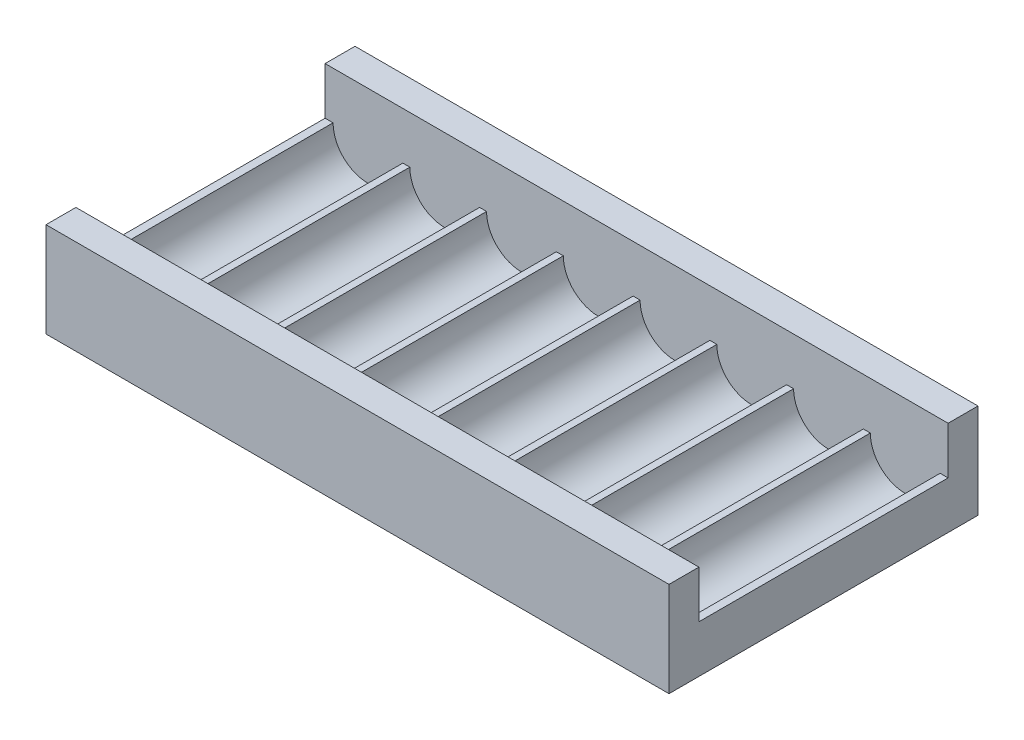
ISO-10303-21;
HEADER;
FILE_DESCRIPTION(('STEP AP214'),'2;1');
FILE_NAME('part.step','',(''),(''),'','','');
FILE_SCHEMA(('AUTOMOTIVE_DESIGN { 1 0 10303 214 1 1 1 1 }'));
ENDSEC;
DATA;
#1=APPLICATION_CONTEXT('core data for automotive mechanical design processes');
#2=APPLICATION_PROTOCOL_DEFINITION('international standard','automotive_design',2000,#1);
#3=PRODUCT_CONTEXT('',#1,'mechanical');
#4=PRODUCT('Part','Part','',(#3));
#5=PRODUCT_RELATED_PRODUCT_CATEGORY('part','',(#4));
#6=PRODUCT_DEFINITION_FORMATION('','',#4);
#7=PRODUCT_DEFINITION_CONTEXT('part definition',#1,'design');
#8=PRODUCT_DEFINITION('design','',#6,#7);
#9=PRODUCT_DEFINITION_SHAPE('','',#8);
#10=(LENGTH_UNIT() NAMED_UNIT(*) SI_UNIT(.MILLI.,.METRE.));
#11=(NAMED_UNIT(*) PLANE_ANGLE_UNIT() SI_UNIT($,.RADIAN.));
#12=(NAMED_UNIT(*) SI_UNIT($,.STERADIAN.) SOLID_ANGLE_UNIT());
#13=UNCERTAINTY_MEASURE_WITH_UNIT(LENGTH_MEASURE(1.E-05),#10,'distance_accuracy_value','');
#14=(GEOMETRIC_REPRESENTATION_CONTEXT(3) GLOBAL_UNCERTAINTY_ASSIGNED_CONTEXT((#13)) GLOBAL_UNIT_ASSIGNED_CONTEXT((#10,
#11,#12)) REPRESENTATION_CONTEXT('',''));
#15=CARTESIAN_POINT('',(0.,0.,0.));
#16=DIRECTION('',(0.,0.,1.));
#17=DIRECTION('',(1.,0.,0.));
#18=AXIS2_PLACEMENT_3D('',#15,#16,#17);
#19=CARTESIAN_POINT('',(0.,0.,6.));
#20=DIRECTION('',(0.,0.,-1.));
#21=DIRECTION('',(-1.,0.,0.));
#22=AXIS2_PLACEMENT_3D('',#19,#20,#21);
#23=PLANE('',#22);
#24=DIRECTION('',(-1.,0.,0.));
#25=VECTOR('',#24,1.);
#26=CARTESIAN_POINT('',(60.9,0.,6.));
#27=LINE('',#26,#25);
#28=CARTESIAN_POINT('',(62.5,0.,6.));
#29=VERTEX_POINT('',#28);
#30=CARTESIAN_POINT('',(60.9,0.,6.));
#31=VERTEX_POINT('',#30);
#32=EDGE_CURVE('E293',#29,#31,#27,.T.);
#33=ORIENTED_EDGE('',*,*,#32,.F.);
#34=DIRECTION('',(0.,1.,0.));
#35=VECTOR('',#34,1.);
#36=CARTESIAN_POINT('',(62.5,9.50000000000001,6.));
#37=LINE('',#36,#35);
#38=CARTESIAN_POINT('',(62.5,9.50000000000001,6.));
#39=VERTEX_POINT('',#38);
#40=EDGE_CURVE('E381',#29,#39,#37,.T.);
#41=ORIENTED_EDGE('',*,*,#40,.T.);
#42=DIRECTION('',(-1.,0.,0.));
#43=VECTOR('',#42,1.);
#44=CARTESIAN_POINT('',(62.5,9.50000000000001,6.));
#45=LINE('',#44,#43);
#46=CARTESIAN_POINT('',(-62.5,9.49999999999999,6.));
#47=VERTEX_POINT('',#46);
#48=EDGE_CURVE('E384',#39,#47,#45,.T.);
#49=ORIENTED_EDGE('',*,*,#48,.T.);
#50=DIRECTION('',(0.,-1.,0.));
#51=VECTOR('',#50,1.);
#52=CARTESIAN_POINT('',(-62.5,9.49999999999999,6.));
#53=LINE('',#52,#51);
#54=CARTESIAN_POINT('',(-62.5,0.,6.));
#55=VERTEX_POINT('',#54);
#56=EDGE_CURVE('E379',#47,#55,#53,.T.);
#57=ORIENTED_EDGE('',*,*,#56,.T.);
#58=DIRECTION('',(-1.,0.,0.));
#59=VECTOR('',#58,1.);
#60=CARTESIAN_POINT('',(-62.5,0.,6.));
#61=LINE('',#60,#59);
#62=CARTESIAN_POINT('',(-60.9,0.,6.));
#63=VERTEX_POINT('',#62);
#64=EDGE_CURVE('E290',#63,#55,#61,.T.);
#65=ORIENTED_EDGE('',*,*,#64,.F.);
#66=CARTESIAN_POINT('',(-53.9,0.,6.));
#67=DIRECTION('',(0.,0.,-1.));
#68=DIRECTION('',(1.,0.,0.));
#69=AXIS2_PLACEMENT_3D('',#66,#67,#68);
#70=CIRCLE('',#69,7.);
#71=CARTESIAN_POINT('',(-46.9,0.,6.));
#72=VERTEX_POINT('',#71);
#73=EDGE_CURVE('E287',#72,#63,#70,.T.);
#74=ORIENTED_EDGE('',*,*,#73,.F.);
#75=DIRECTION('',(-1.,0.,0.));
#76=VECTOR('',#75,1.);
#77=CARTESIAN_POINT('',(-46.9,0.,6.));
#78=LINE('',#77,#76);
#79=CARTESIAN_POINT('',(-45.5,0.,6.));
#80=VERTEX_POINT('',#79);
#81=EDGE_CURVE('E284',#80,#72,#78,.T.);
#82=ORIENTED_EDGE('',*,*,#81,.F.);
#83=CARTESIAN_POINT('',(-38.5,0.,6.));
#84=DIRECTION('',(0.,0.,-1.));
#85=DIRECTION('',(1.,0.,0.));
#86=AXIS2_PLACEMENT_3D('',#83,#84,#85);
#87=CIRCLE('',#86,7.);
#88=CARTESIAN_POINT('',(-31.5,0.,6.));
#89=VERTEX_POINT('',#88);
#90=EDGE_CURVE('E228',#89,#80,#87,.T.);
#91=ORIENTED_EDGE('',*,*,#90,.F.);
#92=DIRECTION('',(-1.,0.,0.));
#93=VECTOR('',#92,1.);
#94=CARTESIAN_POINT('',(-31.5,0.,6.));
#95=LINE('',#94,#93);
#96=CARTESIAN_POINT('',(-30.1,0.,6.));
#97=VERTEX_POINT('',#96);
#98=EDGE_CURVE('E233',#97,#89,#95,.T.);
#99=ORIENTED_EDGE('',*,*,#98,.F.);
#100=CARTESIAN_POINT('',(-23.1,0.,6.));
#101=DIRECTION('',(0.,0.,-1.));
#102=DIRECTION('',(1.,0.,0.));
#103=AXIS2_PLACEMENT_3D('',#100,#101,#102);
#104=CIRCLE('',#103,7.);
#105=CARTESIAN_POINT('',(-16.1,0.,6.));
#106=VERTEX_POINT('',#105);
#107=EDGE_CURVE('E321',#106,#97,#104,.T.);
#108=ORIENTED_EDGE('',*,*,#107,.F.);
#109=DIRECTION('',(-1.,0.,0.));
#110=VECTOR('',#109,1.);
#111=CARTESIAN_POINT('',(-16.1,0.,6.));
#112=LINE('',#111,#110);
#113=CARTESIAN_POINT('',(-14.7,0.,6.));
#114=VERTEX_POINT('',#113);
#115=EDGE_CURVE('E318',#114,#106,#112,.T.);
#116=ORIENTED_EDGE('',*,*,#115,.F.);
#117=CARTESIAN_POINT('',(-7.69999999999999,0.,6.));
#118=DIRECTION('',(0.,0.,-1.));
#119=DIRECTION('',(1.,0.,0.));
#120=AXIS2_PLACEMENT_3D('',#117,#118,#119);
#121=CIRCLE('',#120,7.);
#122=CARTESIAN_POINT('',(-0.699999999999992,0.,6.));
#123=VERTEX_POINT('',#122);
#124=EDGE_CURVE('E315',#123,#114,#121,.T.);
#125=ORIENTED_EDGE('',*,*,#124,.F.);
#126=DIRECTION('',(-1.,0.,0.));
#127=VECTOR('',#126,1.);
#128=CARTESIAN_POINT('',(-0.699999999999992,0.,6.));
#129=LINE('',#128,#127);
#130=CARTESIAN_POINT('',(0.700000000000009,0.,6.));
#131=VERTEX_POINT('',#130);
#132=EDGE_CURVE('E312',#131,#123,#129,.T.);
#133=ORIENTED_EDGE('',*,*,#132,.F.);
#134=CARTESIAN_POINT('',(7.70000000000001,0.,6.));
#135=DIRECTION('',(0.,0.,-1.));
#136=DIRECTION('',(1.,0.,0.));
#137=AXIS2_PLACEMENT_3D('',#134,#135,#136);
#138=CIRCLE('',#137,7.);
#139=CARTESIAN_POINT('',(14.7,0.,6.));
#140=VERTEX_POINT('',#139);
#141=EDGE_CURVE('E309',#140,#131,#138,.T.);
#142=ORIENTED_EDGE('',*,*,#141,.F.);
#143=DIRECTION('',(-1.,0.,0.));
#144=VECTOR('',#143,1.);
#145=CARTESIAN_POINT('',(14.7,0.,6.));
#146=LINE('',#145,#144);
#147=CARTESIAN_POINT('',(16.1,0.,6.));
#148=VERTEX_POINT('',#147);
#149=EDGE_CURVE('E306',#148,#140,#146,.T.);
#150=ORIENTED_EDGE('',*,*,#149,.F.);
#151=CARTESIAN_POINT('',(23.1,0.,6.));
#152=DIRECTION('',(0.,0.,-1.));
#153=DIRECTION('',(1.,0.,0.));
#154=AXIS2_PLACEMENT_3D('',#151,#152,#153);
#155=CIRCLE('',#154,7.);
#156=CARTESIAN_POINT('',(30.1,0.,6.));
#157=VERTEX_POINT('',#156);
#158=EDGE_CURVE('E303',#157,#148,#155,.T.);
#159=ORIENTED_EDGE('',*,*,#158,.F.);
#160=DIRECTION('',(-1.,0.,0.));
#161=VECTOR('',#160,1.);
#162=CARTESIAN_POINT('',(30.1,0.,6.));
#163=LINE('',#162,#161);
#164=CARTESIAN_POINT('',(31.5,0.,6.));
#165=VERTEX_POINT('',#164);
#166=EDGE_CURVE('E300',#165,#157,#163,.T.);
#167=ORIENTED_EDGE('',*,*,#166,.F.);
#168=CARTESIAN_POINT('',(38.5,0.,6.));
#169=DIRECTION('',(0.,0.,-1.));
#170=DIRECTION('',(1.,0.,0.));
#171=AXIS2_PLACEMENT_3D('',#168,#169,#170);
#172=CIRCLE('',#171,7.);
#173=CARTESIAN_POINT('',(45.5,0.,6.));
#174=VERTEX_POINT('',#173);
#175=EDGE_CURVE('E297',#174,#165,#172,.T.);
#176=ORIENTED_EDGE('',*,*,#175,.F.);
#177=DIRECTION('',(-1.,0.,0.));
#178=VECTOR('',#177,1.);
#179=CARTESIAN_POINT('',(45.5,0.,6.));
#180=LINE('',#179,#178);
#181=CARTESIAN_POINT('',(46.9,0.,6.));
#182=VERTEX_POINT('',#181);
#183=EDGE_CURVE('E53',#182,#174,#180,.T.);
#184=ORIENTED_EDGE('',*,*,#183,.F.);
#185=CARTESIAN_POINT('',(53.9,0.,6.));
#186=DIRECTION('',(0.,0.,-1.));
#187=DIRECTION('',(1.,0.,0.));
#188=AXIS2_PLACEMENT_3D('',#185,#186,#187);
#189=CIRCLE('',#188,7.);
#190=EDGE_CURVE('E48',#31,#182,#189,.T.);
#191=ORIENTED_EDGE('',*,*,#190,.F.);
#192=EDGE_LOOP('',(#33,#41,#49,#57,#65,#74,#82,#91,#99,#108,#116,#125,#133,#142,#150,#159,#167,
#176,#184,#191));
#193=FACE_BOUND('',#192,.T.);
#194=ADVANCED_FACE('F33',(#193),#23,.F.);
#195=CARTESIAN_POINT('',(-62.5,9.49999999999999,6.));
#196=DIRECTION('',(1.,0.,0.));
#197=DIRECTION('',(0.,0.,-1.));
#198=AXIS2_PLACEMENT_3D('',#195,#196,#197);
#199=PLANE('',#198);
#200=DIRECTION('',(0.,-1.,0.));
#201=VECTOR('',#200,1.);
#202=CARTESIAN_POINT('',(-62.5,9.49999999999999,0.));
#203=LINE('',#202,#201);
#204=CARTESIAN_POINT('',(-62.5,9.49999999999999,0.));
#205=VERTEX_POINT('',#204);
#206=CARTESIAN_POINT('',(-62.5,-9.50000000000001,0.));
#207=VERTEX_POINT('',#206);
#208=EDGE_CURVE('E198',#205,#207,#203,.T.);
#209=ORIENTED_EDGE('',*,*,#208,.T.);
#210=DIRECTION('',(0.,0.,-1.));
#211=VECTOR('',#210,1.);
#212=CARTESIAN_POINT('',(-62.5,-9.50000000000001,6.));
#213=LINE('',#212,#211);
#214=CARTESIAN_POINT('',(-62.5,-9.50000000000001,62.));
#215=VERTEX_POINT('',#214);
#216=EDGE_CURVE('E11',#215,#207,#213,.T.);
#217=ORIENTED_EDGE('',*,*,#216,.F.);
#218=DIRECTION('',(0.,-1.,0.));
#219=VECTOR('',#218,1.);
#220=CARTESIAN_POINT('',(-62.5,-9.50000000000001,62.));
#221=LINE('',#220,#219);
#222=CARTESIAN_POINT('',(-62.5,9.50000000000001,62.));
#223=VERTEX_POINT('',#222);
#224=EDGE_CURVE('E195',#223,#215,#221,.T.);
#225=ORIENTED_EDGE('',*,*,#224,.F.);
#226=DIRECTION('',(0.,0.,-1.));
#227=VECTOR('',#226,1.);
#228=CARTESIAN_POINT('',(-62.5,9.50000000000001,62.));
#229=LINE('',#228,#227);
#230=CARTESIAN_POINT('',(-62.5,9.50000000000001,56.));
#231=VERTEX_POINT('',#230);
#232=EDGE_CURVE('E219',#223,#231,#229,.T.);
#233=ORIENTED_EDGE('',*,*,#232,.T.);
#234=DIRECTION('',(0.,-1.,0.));
#235=VECTOR('',#234,1.);
#236=CARTESIAN_POINT('',(-62.5,-9.50000000000001,56.));
#237=LINE('',#236,#235);
#238=CARTESIAN_POINT('',(-62.5,0.,56.));
#239=VERTEX_POINT('',#238);
#240=EDGE_CURVE('E220',#231,#239,#237,.T.);
#241=ORIENTED_EDGE('',*,*,#240,.T.);
#242=DIRECTION('',(0.,0.,-1.));
#243=VECTOR('',#242,1.);
#244=CARTESIAN_POINT('',(-62.5,0.,56.));
#245=LINE('',#244,#243);
#246=EDGE_CURVE('E367',#239,#55,#245,.T.);
#247=ORIENTED_EDGE('',*,*,#246,.T.);
#248=ORIENTED_EDGE('',*,*,#56,.F.);
#249=DIRECTION('',(0.,0.,-1.));
#250=VECTOR('',#249,1.);
#251=CARTESIAN_POINT('',(-62.5,9.49999999999999,6.));
#252=LINE('',#251,#250);
#253=EDGE_CURVE('E386',#47,#205,#252,.T.);
#254=ORIENTED_EDGE('',*,*,#253,.T.);
#255=EDGE_LOOP('',(#209,#217,#225,#233,#241,#247,#248,#254));
#256=FACE_BOUND('',#255,.T.);
#257=ADVANCED_FACE('F35',(#256),#199,.F.);
#258=CARTESIAN_POINT('',(62.5,-9.49999999999999,6.));
#259=DIRECTION('',(0.,1.,0.));
#260=DIRECTION('',(-1.,0.,0.));
#261=AXIS2_PLACEMENT_3D('',#258,#259,#260);
#262=PLANE('',#261);
#263=DIRECTION('',(1.,0.,0.));
#264=VECTOR('',#263,1.);
#265=CARTESIAN_POINT('',(62.5,-9.49999999999999,0.));
#266=LINE('',#265,#264);
#267=CARTESIAN_POINT('',(62.5,-9.49999999999999,0.));
#268=VERTEX_POINT('',#267);
#269=EDGE_CURVE('E388',#207,#268,#266,.T.);
#270=ORIENTED_EDGE('',*,*,#269,.T.);
#271=DIRECTION('',(0.,0.,-1.));
#272=VECTOR('',#271,1.);
#273=CARTESIAN_POINT('',(62.5,-9.49999999999999,6.));
#274=LINE('',#273,#272);
#275=CARTESIAN_POINT('',(62.5,-9.50000000000001,62.));
#276=VERTEX_POINT('',#275);
#277=EDGE_CURVE('E41',#276,#268,#274,.T.);
#278=ORIENTED_EDGE('',*,*,#277,.F.);
#279=DIRECTION('',(1.,0.,0.));
#280=VECTOR('',#279,1.);
#281=CARTESIAN_POINT('',(-62.5,-9.50000000000001,62.));
#282=LINE('',#281,#280);
#283=EDGE_CURVE('E201',#215,#276,#282,.T.);
#284=ORIENTED_EDGE('',*,*,#283,.F.);
#285=ORIENTED_EDGE('',*,*,#216,.T.);
#286=EDGE_LOOP('',(#270,#278,#284,#285));
#287=FACE_BOUND('',#286,.T.);
#288=ADVANCED_FACE('F202',(#287),#262,.F.);
#289=CARTESIAN_POINT('',(62.5,9.50000000000001,6.));
#290=DIRECTION('',(-1.,0.,0.));
#291=DIRECTION('',(0.,0.,1.));
#292=AXIS2_PLACEMENT_3D('',#289,#290,#291);
#293=PLANE('',#292);
#294=DIRECTION('',(0.,1.,0.));
#295=VECTOR('',#294,1.);
#296=CARTESIAN_POINT('',(62.5,9.50000000000001,0.));
#297=LINE('',#296,#295);
#298=CARTESIAN_POINT('',(62.5,9.50000000000001,0.));
#299=VERTEX_POINT('',#298);
#300=EDGE_CURVE('E390',#268,#299,#297,.T.);
#301=ORIENTED_EDGE('',*,*,#300,.T.);
#302=DIRECTION('',(0.,0.,-1.));
#303=VECTOR('',#302,1.);
#304=CARTESIAN_POINT('',(62.5,9.50000000000001,6.));
#305=LINE('',#304,#303);
#306=EDGE_CURVE('E394',#39,#299,#305,.T.);
#307=ORIENTED_EDGE('',*,*,#306,.F.);
#308=ORIENTED_EDGE('',*,*,#40,.F.);
#309=DIRECTION('',(0.,0.,-1.));
#310=VECTOR('',#309,1.);
#311=CARTESIAN_POINT('',(62.5,0.,56.));
#312=LINE('',#311,#310);
#313=CARTESIAN_POINT('',(62.5,0.,56.));
#314=VERTEX_POINT('',#313);
#315=EDGE_CURVE('E364',#314,#29,#312,.T.);
#316=ORIENTED_EDGE('',*,*,#315,.F.);
#317=DIRECTION('',(0.,1.,0.));
#318=VECTOR('',#317,1.);
#319=CARTESIAN_POINT('',(62.5,-9.50000000000001,56.));
#320=LINE('',#319,#318);
#321=CARTESIAN_POINT('',(62.5,9.50000000000001,56.));
#322=VERTEX_POINT('',#321);
#323=EDGE_CURVE('E214',#314,#322,#320,.T.);
#324=ORIENTED_EDGE('',*,*,#323,.T.);
#325=DIRECTION('',(0.,0.,-1.));
#326=VECTOR('',#325,1.);
#327=CARTESIAN_POINT('',(62.5,9.50000000000001,62.));
#328=LINE('',#327,#326);
#329=CARTESIAN_POINT('',(62.5,9.50000000000001,62.));
#330=VERTEX_POINT('',#329);
#331=EDGE_CURVE('E225',#330,#322,#328,.T.);
#332=ORIENTED_EDGE('',*,*,#331,.F.);
#333=DIRECTION('',(0.,1.,0.));
#334=VECTOR('',#333,1.);
#335=CARTESIAN_POINT('',(62.5,-9.50000000000001,62.));
#336=LINE('',#335,#334);
#337=EDGE_CURVE('E206',#276,#330,#336,.T.);
#338=ORIENTED_EDGE('',*,*,#337,.F.);
#339=ORIENTED_EDGE('',*,*,#277,.T.);
#340=EDGE_LOOP('',(#301,#307,#308,#316,#324,#332,#338,#339));
#341=FACE_BOUND('',#340,.T.);
#342=ADVANCED_FACE('F398',(#341),#293,.F.);
#343=CARTESIAN_POINT('',(62.5,9.50000000000001,6.));
#344=DIRECTION('',(0.,-1.,0.));
#345=DIRECTION('',(1.,0.,0.));
#346=AXIS2_PLACEMENT_3D('',#343,#344,#345);
#347=PLANE('',#346);
#348=DIRECTION('',(-1.,0.,0.));
#349=VECTOR('',#348,1.);
#350=CARTESIAN_POINT('',(62.5,9.50000000000001,0.));
#351=LINE('',#350,#349);
#352=EDGE_CURVE('E382',#299,#205,#351,.T.);
#353=ORIENTED_EDGE('',*,*,#352,.T.);
#354=ORIENTED_EDGE('',*,*,#253,.F.);
#355=ORIENTED_EDGE('',*,*,#48,.F.);
#356=ORIENTED_EDGE('',*,*,#306,.T.);
#357=EDGE_LOOP('',(#353,#354,#355,#356));
#358=FACE_BOUND('',#357,.T.);
#359=ADVANCED_FACE('F406',(#358),#347,.F.);
#360=CARTESIAN_POINT('',(0.,0.,0.));
#361=DIRECTION('',(0.,0.,-1.));
#362=DIRECTION('',(-1.,0.,0.));
#363=AXIS2_PLACEMENT_3D('',#360,#361,#362);
#364=PLANE('',#363);
#365=ORIENTED_EDGE('',*,*,#208,.F.);
#366=ORIENTED_EDGE('',*,*,#352,.F.);
#367=ORIENTED_EDGE('',*,*,#300,.F.);
#368=ORIENTED_EDGE('',*,*,#269,.F.);
#369=EDGE_LOOP('',(#365,#366,#367,#368));
#370=FACE_BOUND('',#369,.T.);
#371=ADVANCED_FACE('F403',(#370),#364,.T.);
#372=CARTESIAN_POINT('',(-38.5,0.,56.));
#373=DIRECTION('',(0.,0.,-1.));
#374=DIRECTION('',(-1.,0.,0.));
#375=AXIS2_PLACEMENT_3D('',#372,#373,#374);
#376=CYLINDRICAL_SURFACE('',#375,7.);
#377=ORIENTED_EDGE('',*,*,#90,.T.);
#378=DIRECTION('',(0.,0.,-1.));
#379=VECTOR('',#378,1.);
#380=CARTESIAN_POINT('',(-45.5,0.,56.));
#381=LINE('',#380,#379);
#382=CARTESIAN_POINT('',(-45.5,0.,56.));
#383=VERTEX_POINT('',#382);
#384=EDGE_CURVE('E376',#383,#80,#381,.T.);
#385=ORIENTED_EDGE('',*,*,#384,.F.);
#386=CARTESIAN_POINT('',(-38.5,0.,56.));
#387=DIRECTION('',(0.,0.,-1.));
#388=DIRECTION('',(1.,0.,0.));
#389=AXIS2_PLACEMENT_3D('',#386,#387,#388);
#390=CIRCLE('',#389,7.);
#391=CARTESIAN_POINT('',(-31.5,0.,56.));
#392=VERTEX_POINT('',#391);
#393=EDGE_CURVE('E229',#392,#383,#390,.T.);
#394=ORIENTED_EDGE('',*,*,#393,.F.);
#395=DIRECTION('',(0.,0.,-1.));
#396=VECTOR('',#395,1.);
#397=CARTESIAN_POINT('',(-31.5,0.,56.));
#398=LINE('',#397,#396);
#399=EDGE_CURVE('E281',#392,#89,#398,.T.);
#400=ORIENTED_EDGE('',*,*,#399,.T.);
#401=EDGE_LOOP('',(#377,#385,#394,#400));
#402=FACE_BOUND('',#401,.T.);
#403=ADVANCED_FACE('F419',(#402),#376,.F.);
#404=CARTESIAN_POINT('',(-46.9,0.,56.));
#405=DIRECTION('',(0.,-1.,0.));
#406=DIRECTION('',(1.,0.,0.));
#407=AXIS2_PLACEMENT_3D('',#404,#405,#406);
#408=PLANE('',#407);
#409=ORIENTED_EDGE('',*,*,#81,.T.);
#410=DIRECTION('',(0.,0.,-1.));
#411=VECTOR('',#410,1.);
#412=CARTESIAN_POINT('',(-46.9,0.,56.));
#413=LINE('',#412,#411);
#414=CARTESIAN_POINT('',(-46.9,0.,56.));
#415=VERTEX_POINT('',#414);
#416=EDGE_CURVE('E373',#415,#72,#413,.T.);
#417=ORIENTED_EDGE('',*,*,#416,.F.);
#418=DIRECTION('',(-1.,0.,0.));
#419=VECTOR('',#418,1.);
#420=CARTESIAN_POINT('',(-46.9,0.,56.));
#421=LINE('',#420,#419);
#422=EDGE_CURVE('E232',#383,#415,#421,.T.);
#423=ORIENTED_EDGE('',*,*,#422,.F.);
#424=ORIENTED_EDGE('',*,*,#384,.T.);
#425=EDGE_LOOP('',(#409,#417,#423,#424));
#426=FACE_BOUND('',#425,.T.);
#427=ADVANCED_FACE('F416',(#426),#408,.F.);
#428=CARTESIAN_POINT('',(-53.9,0.,56.));
#429=DIRECTION('',(0.,0.,-1.));
#430=DIRECTION('',(-1.,0.,0.));
#431=AXIS2_PLACEMENT_3D('',#428,#429,#430);
#432=CYLINDRICAL_SURFACE('',#431,7.);
#433=ORIENTED_EDGE('',*,*,#73,.T.);
#434=DIRECTION('',(0.,0.,-1.));
#435=VECTOR('',#434,1.);
#436=CARTESIAN_POINT('',(-60.9,0.,56.));
#437=LINE('',#436,#435);
#438=CARTESIAN_POINT('',(-60.9,0.,56.));
#439=VERTEX_POINT('',#438);
#440=EDGE_CURVE('E370',#439,#63,#437,.T.);
#441=ORIENTED_EDGE('',*,*,#440,.F.);
#442=CARTESIAN_POINT('',(-53.9,0.,56.));
#443=DIRECTION('',(0.,0.,-1.));
#444=DIRECTION('',(1.,0.,0.));
#445=AXIS2_PLACEMENT_3D('',#442,#443,#444);
#446=CIRCLE('',#445,7.);
#447=EDGE_CURVE('E236',#415,#439,#446,.T.);
#448=ORIENTED_EDGE('',*,*,#447,.F.);
#449=ORIENTED_EDGE('',*,*,#416,.T.);
#450=EDGE_LOOP('',(#433,#441,#448,#449));
#451=FACE_BOUND('',#450,.T.);
#452=ADVANCED_FACE('F414',(#451),#432,.F.);
#453=CARTESIAN_POINT('',(-62.5,0.,56.));
#454=DIRECTION('',(0.,-1.,0.));
#455=DIRECTION('',(1.,0.,0.));
#456=AXIS2_PLACEMENT_3D('',#453,#454,#455);
#457=PLANE('',#456);
#458=ORIENTED_EDGE('',*,*,#64,.T.);
#459=ORIENTED_EDGE('',*,*,#246,.F.);
#460=DIRECTION('',(-1.,0.,0.));
#461=VECTOR('',#460,1.);
#462=CARTESIAN_POINT('',(-62.5,0.,56.));
#463=LINE('',#462,#461);
#464=EDGE_CURVE('E239',#439,#239,#463,.T.);
#465=ORIENTED_EDGE('',*,*,#464,.F.);
#466=ORIENTED_EDGE('',*,*,#440,.T.);
#467=EDGE_LOOP('',(#458,#459,#465,#466));
#468=FACE_BOUND('',#467,.T.);
#469=ADVANCED_FACE('F410',(#468),#457,.F.);
#470=CARTESIAN_POINT('',(60.9,0.,56.));
#471=DIRECTION('',(0.,-1.,0.));
#472=DIRECTION('',(1.,0.,0.));
#473=AXIS2_PLACEMENT_3D('',#470,#471,#472);
#474=PLANE('',#473);
#475=ORIENTED_EDGE('',*,*,#32,.T.);
#476=DIRECTION('',(0.,0.,-1.));
#477=VECTOR('',#476,1.);
#478=CARTESIAN_POINT('',(60.9,0.,56.));
#479=LINE('',#478,#477);
#480=CARTESIAN_POINT('',(60.9,0.,56.));
#481=VERTEX_POINT('',#480);
#482=EDGE_CURVE('E361',#481,#31,#479,.T.);
#483=ORIENTED_EDGE('',*,*,#482,.F.);
#484=DIRECTION('',(-1.,0.,0.));
#485=VECTOR('',#484,1.);
#486=CARTESIAN_POINT('',(60.9,0.,56.));
#487=LINE('',#486,#485);
#488=EDGE_CURVE('E242',#314,#481,#487,.T.);
#489=ORIENTED_EDGE('',*,*,#488,.F.);
#490=ORIENTED_EDGE('',*,*,#315,.T.);
#491=EDGE_LOOP('',(#475,#483,#489,#490));
#492=FACE_BOUND('',#491,.T.);
#493=ADVANCED_FACE('F459',(#492),#474,.F.);
#494=CARTESIAN_POINT('',(53.9,0.,56.));
#495=DIRECTION('',(0.,0.,-1.));
#496=DIRECTION('',(-1.,0.,0.));
#497=AXIS2_PLACEMENT_3D('',#494,#495,#496);
#498=CYLINDRICAL_SURFACE('',#497,7.);
#499=ORIENTED_EDGE('',*,*,#190,.T.);
#500=DIRECTION('',(0.,0.,-1.));
#501=VECTOR('',#500,1.);
#502=CARTESIAN_POINT('',(46.9,0.,56.));
#503=LINE('',#502,#501);
#504=CARTESIAN_POINT('',(46.9,0.,56.));
#505=VERTEX_POINT('',#504);
#506=EDGE_CURVE('E358',#505,#182,#503,.T.);
#507=ORIENTED_EDGE('',*,*,#506,.F.);
#508=CARTESIAN_POINT('',(53.9,0.,56.));
#509=DIRECTION('',(0.,0.,-1.));
#510=DIRECTION('',(1.,0.,0.));
#511=AXIS2_PLACEMENT_3D('',#508,#509,#510);
#512=CIRCLE('',#511,7.);
#513=EDGE_CURVE('E245',#481,#505,#512,.T.);
#514=ORIENTED_EDGE('',*,*,#513,.F.);
#515=ORIENTED_EDGE('',*,*,#482,.T.);
#516=EDGE_LOOP('',(#499,#507,#514,#515));
#517=FACE_BOUND('',#516,.T.);
#518=ADVANCED_FACE('F456',(#517),#498,.F.);
#519=CARTESIAN_POINT('',(45.5,0.,56.));
#520=DIRECTION('',(0.,-1.,0.));
#521=DIRECTION('',(1.,0.,0.));
#522=AXIS2_PLACEMENT_3D('',#519,#520,#521);
#523=PLANE('',#522);
#524=ORIENTED_EDGE('',*,*,#183,.T.);
#525=DIRECTION('',(0.,0.,-1.));
#526=VECTOR('',#525,1.);
#527=CARTESIAN_POINT('',(45.5,0.,56.));
#528=LINE('',#527,#526);
#529=CARTESIAN_POINT('',(45.5,0.,56.));
#530=VERTEX_POINT('',#529);
#531=EDGE_CURVE('E355',#530,#174,#528,.T.);
#532=ORIENTED_EDGE('',*,*,#531,.F.);
#533=DIRECTION('',(-1.,0.,0.));
#534=VECTOR('',#533,1.);
#535=CARTESIAN_POINT('',(45.5,0.,56.));
#536=LINE('',#535,#534);
#537=EDGE_CURVE('E248',#505,#530,#536,.T.);
#538=ORIENTED_EDGE('',*,*,#537,.F.);
#539=ORIENTED_EDGE('',*,*,#506,.T.);
#540=EDGE_LOOP('',(#524,#532,#538,#539));
#541=FACE_BOUND('',#540,.T.);
#542=ADVANCED_FACE('F452',(#541),#523,.F.);
#543=CARTESIAN_POINT('',(38.5,0.,56.));
#544=DIRECTION('',(0.,0.,-1.));
#545=DIRECTION('',(-1.,0.,0.));
#546=AXIS2_PLACEMENT_3D('',#543,#544,#545);
#547=CYLINDRICAL_SURFACE('',#546,7.);
#548=ORIENTED_EDGE('',*,*,#175,.T.);
#549=DIRECTION('',(0.,0.,-1.));
#550=VECTOR('',#549,1.);
#551=CARTESIAN_POINT('',(31.5,0.,56.));
#552=LINE('',#551,#550);
#553=CARTESIAN_POINT('',(31.5,0.,56.));
#554=VERTEX_POINT('',#553);
#555=EDGE_CURVE('E352',#554,#165,#552,.T.);
#556=ORIENTED_EDGE('',*,*,#555,.F.);
#557=CARTESIAN_POINT('',(38.5,0.,56.));
#558=DIRECTION('',(0.,0.,-1.));
#559=DIRECTION('',(1.,0.,0.));
#560=AXIS2_PLACEMENT_3D('',#557,#558,#559);
#561=CIRCLE('',#560,7.);
#562=EDGE_CURVE('E251',#530,#554,#561,.T.);
#563=ORIENTED_EDGE('',*,*,#562,.F.);
#564=ORIENTED_EDGE('',*,*,#531,.T.);
#565=EDGE_LOOP('',(#548,#556,#563,#564));
#566=FACE_BOUND('',#565,.T.);
#567=ADVANCED_FACE('F450',(#566),#547,.F.);
#568=CARTESIAN_POINT('',(30.1,0.,56.));
#569=DIRECTION('',(0.,-1.,0.));
#570=DIRECTION('',(1.,0.,0.));
#571=AXIS2_PLACEMENT_3D('',#568,#569,#570);
#572=PLANE('',#571);
#573=ORIENTED_EDGE('',*,*,#166,.T.);
#574=DIRECTION('',(0.,0.,-1.));
#575=VECTOR('',#574,1.);
#576=CARTESIAN_POINT('',(30.1,0.,56.));
#577=LINE('',#576,#575);
#578=CARTESIAN_POINT('',(30.1,0.,56.));
#579=VERTEX_POINT('',#578);
#580=EDGE_CURVE('E349',#579,#157,#577,.T.);
#581=ORIENTED_EDGE('',*,*,#580,.F.);
#582=DIRECTION('',(-1.,0.,0.));
#583=VECTOR('',#582,1.);
#584=CARTESIAN_POINT('',(30.1,0.,56.));
#585=LINE('',#584,#583);
#586=EDGE_CURVE('E254',#554,#579,#585,.T.);
#587=ORIENTED_EDGE('',*,*,#586,.F.);
#588=ORIENTED_EDGE('',*,*,#555,.T.);
#589=EDGE_LOOP('',(#573,#581,#587,#588));
#590=FACE_BOUND('',#589,.T.);
#591=ADVANCED_FACE('F446',(#590),#572,.F.);
#592=CARTESIAN_POINT('',(23.1,0.,56.));
#593=DIRECTION('',(0.,0.,-1.));
#594=DIRECTION('',(-1.,0.,0.));
#595=AXIS2_PLACEMENT_3D('',#592,#593,#594);
#596=CYLINDRICAL_SURFACE('',#595,7.);
#597=ORIENTED_EDGE('',*,*,#158,.T.);
#598=DIRECTION('',(0.,0.,-1.));
#599=VECTOR('',#598,1.);
#600=CARTESIAN_POINT('',(16.1,0.,56.));
#601=LINE('',#600,#599);
#602=CARTESIAN_POINT('',(16.1,0.,56.));
#603=VERTEX_POINT('',#602);
#604=EDGE_CURVE('E346',#603,#148,#601,.T.);
#605=ORIENTED_EDGE('',*,*,#604,.F.);
#606=CARTESIAN_POINT('',(23.1,0.,56.));
#607=DIRECTION('',(0.,0.,-1.));
#608=DIRECTION('',(1.,0.,0.));
#609=AXIS2_PLACEMENT_3D('',#606,#607,#608);
#610=CIRCLE('',#609,7.);
#611=EDGE_CURVE('E257',#579,#603,#610,.T.);
#612=ORIENTED_EDGE('',*,*,#611,.F.);
#613=ORIENTED_EDGE('',*,*,#580,.T.);
#614=EDGE_LOOP('',(#597,#605,#612,#613));
#615=FACE_BOUND('',#614,.T.);
#616=ADVANCED_FACE('F444',(#615),#596,.F.);
#617=CARTESIAN_POINT('',(14.7,0.,56.));
#618=DIRECTION('',(0.,-1.,0.));
#619=DIRECTION('',(1.,0.,0.));
#620=AXIS2_PLACEMENT_3D('',#617,#618,#619);
#621=PLANE('',#620);
#622=ORIENTED_EDGE('',*,*,#149,.T.);
#623=DIRECTION('',(0.,0.,-1.));
#624=VECTOR('',#623,1.);
#625=CARTESIAN_POINT('',(14.7,0.,56.));
#626=LINE('',#625,#624);
#627=CARTESIAN_POINT('',(14.7,0.,56.));
#628=VERTEX_POINT('',#627);
#629=EDGE_CURVE('E343',#628,#140,#626,.T.);
#630=ORIENTED_EDGE('',*,*,#629,.F.);
#631=DIRECTION('',(-1.,0.,0.));
#632=VECTOR('',#631,1.);
#633=CARTESIAN_POINT('',(14.7,0.,56.));
#634=LINE('',#633,#632);
#635=EDGE_CURVE('E260',#603,#628,#634,.T.);
#636=ORIENTED_EDGE('',*,*,#635,.F.);
#637=ORIENTED_EDGE('',*,*,#604,.T.);
#638=EDGE_LOOP('',(#622,#630,#636,#637));
#639=FACE_BOUND('',#638,.T.);
#640=ADVANCED_FACE('F440',(#639),#621,.F.);
#641=CARTESIAN_POINT('',(7.70000000000001,0.,56.));
#642=DIRECTION('',(0.,0.,-1.));
#643=DIRECTION('',(-1.,0.,0.));
#644=AXIS2_PLACEMENT_3D('',#641,#642,#643);
#645=CYLINDRICAL_SURFACE('',#644,7.);
#646=ORIENTED_EDGE('',*,*,#141,.T.);
#647=DIRECTION('',(0.,0.,-1.));
#648=VECTOR('',#647,1.);
#649=CARTESIAN_POINT('',(0.700000000000009,0.,56.));
#650=LINE('',#649,#648);
#651=CARTESIAN_POINT('',(0.700000000000009,0.,56.));
#652=VERTEX_POINT('',#651);
#653=EDGE_CURVE('E340',#652,#131,#650,.T.);
#654=ORIENTED_EDGE('',*,*,#653,.F.);
#655=CARTESIAN_POINT('',(7.70000000000001,0.,56.));
#656=DIRECTION('',(0.,0.,-1.));
#657=DIRECTION('',(1.,0.,0.));
#658=AXIS2_PLACEMENT_3D('',#655,#656,#657);
#659=CIRCLE('',#658,7.);
#660=EDGE_CURVE('E263',#628,#652,#659,.T.);
#661=ORIENTED_EDGE('',*,*,#660,.F.);
#662=ORIENTED_EDGE('',*,*,#629,.T.);
#663=EDGE_LOOP('',(#646,#654,#661,#662));
#664=FACE_BOUND('',#663,.T.);
#665=ADVANCED_FACE('F438',(#664),#645,.F.);
#666=CARTESIAN_POINT('',(-0.699999999999992,0.,56.));
#667=DIRECTION('',(0.,-1.,0.));
#668=DIRECTION('',(1.,0.,0.));
#669=AXIS2_PLACEMENT_3D('',#666,#667,#668);
#670=PLANE('',#669);
#671=ORIENTED_EDGE('',*,*,#132,.T.);
#672=DIRECTION('',(0.,0.,-1.));
#673=VECTOR('',#672,1.);
#674=CARTESIAN_POINT('',(-0.699999999999992,0.,56.));
#675=LINE('',#674,#673);
#676=CARTESIAN_POINT('',(-0.699999999999992,0.,56.));
#677=VERTEX_POINT('',#676);
#678=EDGE_CURVE('E337',#677,#123,#675,.T.);
#679=ORIENTED_EDGE('',*,*,#678,.F.);
#680=DIRECTION('',(-1.,0.,0.));
#681=VECTOR('',#680,1.);
#682=CARTESIAN_POINT('',(-0.699999999999992,0.,56.));
#683=LINE('',#682,#681);
#684=EDGE_CURVE('E266',#652,#677,#683,.T.);
#685=ORIENTED_EDGE('',*,*,#684,.F.);
#686=ORIENTED_EDGE('',*,*,#653,.T.);
#687=EDGE_LOOP('',(#671,#679,#685,#686));
#688=FACE_BOUND('',#687,.T.);
#689=ADVANCED_FACE('F434',(#688),#670,.F.);
#690=CARTESIAN_POINT('',(-7.69999999999999,0.,56.));
#691=DIRECTION('',(0.,0.,-1.));
#692=DIRECTION('',(-1.,0.,0.));
#693=AXIS2_PLACEMENT_3D('',#690,#691,#692);
#694=CYLINDRICAL_SURFACE('',#693,7.);
#695=ORIENTED_EDGE('',*,*,#124,.T.);
#696=DIRECTION('',(0.,0.,-1.));
#697=VECTOR('',#696,1.);
#698=CARTESIAN_POINT('',(-14.7,0.,56.));
#699=LINE('',#698,#697);
#700=CARTESIAN_POINT('',(-14.7,0.,56.));
#701=VERTEX_POINT('',#700);
#702=EDGE_CURVE('E334',#701,#114,#699,.T.);
#703=ORIENTED_EDGE('',*,*,#702,.F.);
#704=CARTESIAN_POINT('',(-7.69999999999999,0.,56.));
#705=DIRECTION('',(0.,0.,-1.));
#706=DIRECTION('',(1.,0.,0.));
#707=AXIS2_PLACEMENT_3D('',#704,#705,#706);
#708=CIRCLE('',#707,7.);
#709=EDGE_CURVE('E269',#677,#701,#708,.T.);
#710=ORIENTED_EDGE('',*,*,#709,.F.);
#711=ORIENTED_EDGE('',*,*,#678,.T.);
#712=EDGE_LOOP('',(#695,#703,#710,#711));
#713=FACE_BOUND('',#712,.T.);
#714=ADVANCED_FACE('F432',(#713),#694,.F.);
#715=CARTESIAN_POINT('',(-16.1,0.,56.));
#716=DIRECTION('',(0.,-1.,0.));
#717=DIRECTION('',(1.,0.,0.));
#718=AXIS2_PLACEMENT_3D('',#715,#716,#717);
#719=PLANE('',#718);
#720=ORIENTED_EDGE('',*,*,#115,.T.);
#721=DIRECTION('',(0.,0.,-1.));
#722=VECTOR('',#721,1.);
#723=CARTESIAN_POINT('',(-16.1,0.,56.));
#724=LINE('',#723,#722);
#725=CARTESIAN_POINT('',(-16.1,0.,56.));
#726=VERTEX_POINT('',#725);
#727=EDGE_CURVE('E331',#726,#106,#724,.T.);
#728=ORIENTED_EDGE('',*,*,#727,.F.);
#729=DIRECTION('',(-1.,0.,0.));
#730=VECTOR('',#729,1.);
#731=CARTESIAN_POINT('',(-16.1,0.,56.));
#732=LINE('',#731,#730);
#733=EDGE_CURVE('E272',#701,#726,#732,.T.);
#734=ORIENTED_EDGE('',*,*,#733,.F.);
#735=ORIENTED_EDGE('',*,*,#702,.T.);
#736=EDGE_LOOP('',(#720,#728,#734,#735));
#737=FACE_BOUND('',#736,.T.);
#738=ADVANCED_FACE('F428',(#737),#719,.F.);
#739=CARTESIAN_POINT('',(-23.1,0.,56.));
#740=DIRECTION('',(0.,0.,-1.));
#741=DIRECTION('',(-1.,0.,0.));
#742=AXIS2_PLACEMENT_3D('',#739,#740,#741);
#743=CYLINDRICAL_SURFACE('',#742,7.);
#744=ORIENTED_EDGE('',*,*,#107,.T.);
#745=DIRECTION('',(0.,0.,-1.));
#746=VECTOR('',#745,1.);
#747=CARTESIAN_POINT('',(-30.1,0.,56.));
#748=LINE('',#747,#746);
#749=CARTESIAN_POINT('',(-30.1,0.,56.));
#750=VERTEX_POINT('',#749);
#751=EDGE_CURVE('E328',#750,#97,#748,.T.);
#752=ORIENTED_EDGE('',*,*,#751,.F.);
#753=CARTESIAN_POINT('',(-23.1,0.,56.));
#754=DIRECTION('',(0.,0.,-1.));
#755=DIRECTION('',(1.,0.,0.));
#756=AXIS2_PLACEMENT_3D('',#753,#754,#755);
#757=CIRCLE('',#756,7.);
#758=EDGE_CURVE('E275',#726,#750,#757,.T.);
#759=ORIENTED_EDGE('',*,*,#758,.F.);
#760=ORIENTED_EDGE('',*,*,#727,.T.);
#761=EDGE_LOOP('',(#744,#752,#759,#760));
#762=FACE_BOUND('',#761,.T.);
#763=ADVANCED_FACE('F426',(#762),#743,.F.);
#764=CARTESIAN_POINT('',(-31.5,0.,56.));
#765=DIRECTION('',(0.,-1.,0.));
#766=DIRECTION('',(1.,0.,0.));
#767=AXIS2_PLACEMENT_3D('',#764,#765,#766);
#768=PLANE('',#767);
#769=ORIENTED_EDGE('',*,*,#98,.T.);
#770=ORIENTED_EDGE('',*,*,#399,.F.);
#771=DIRECTION('',(-1.,0.,0.));
#772=VECTOR('',#771,1.);
#773=CARTESIAN_POINT('',(-31.5,0.,56.));
#774=LINE('',#773,#772);
#775=EDGE_CURVE('E278',#750,#392,#774,.T.);
#776=ORIENTED_EDGE('',*,*,#775,.F.);
#777=ORIENTED_EDGE('',*,*,#751,.T.);
#778=EDGE_LOOP('',(#769,#770,#776,#777));
#779=FACE_BOUND('',#778,.T.);
#780=ADVANCED_FACE('F422',(#779),#768,.F.);
#781=CARTESIAN_POINT('',(-62.5,9.50000000000001,62.));
#782=DIRECTION('',(0.,-1.,0.));
#783=DIRECTION('',(0.,0.,-1.));
#784=AXIS2_PLACEMENT_3D('',#781,#782,#783);
#785=PLANE('',#784);
#786=DIRECTION('',(-1.,0.,0.));
#787=VECTOR('',#786,1.);
#788=CARTESIAN_POINT('',(-62.5,9.50000000000001,56.));
#789=LINE('',#788,#787);
#790=EDGE_CURVE('E212',#322,#231,#789,.T.);
#791=ORIENTED_EDGE('',*,*,#790,.T.);
#792=ORIENTED_EDGE('',*,*,#232,.F.);
#793=DIRECTION('',(-1.,0.,0.));
#794=VECTOR('',#793,1.);
#795=CARTESIAN_POINT('',(-62.5,9.50000000000001,62.));
#796=LINE('',#795,#794);
#797=EDGE_CURVE('E210',#330,#223,#796,.T.);
#798=ORIENTED_EDGE('',*,*,#797,.F.);
#799=ORIENTED_EDGE('',*,*,#331,.T.);
#800=EDGE_LOOP('',(#791,#792,#798,#799));
#801=FACE_BOUND('',#800,.T.);
#802=ADVANCED_FACE('F465',(#801),#785,.F.);
#803=CARTESIAN_POINT('',(0.,0.,62.));
#804=DIRECTION('',(0.,0.,-1.));
#805=DIRECTION('',(-1.,0.,0.));
#806=AXIS2_PLACEMENT_3D('',#803,#804,#805);
#807=PLANE('',#806);
#808=ORIENTED_EDGE('',*,*,#224,.T.);
#809=ORIENTED_EDGE('',*,*,#283,.T.);
#810=ORIENTED_EDGE('',*,*,#337,.T.);
#811=ORIENTED_EDGE('',*,*,#797,.T.);
#812=EDGE_LOOP('',(#808,#809,#810,#811));
#813=FACE_BOUND('',#812,.T.);
#814=ADVANCED_FACE('F208',(#813),#807,.F.);
#815=CARTESIAN_POINT('',(0.,0.,56.));
#816=DIRECTION('',(0.,0.,-1.));
#817=DIRECTION('',(-1.,0.,0.));
#818=AXIS2_PLACEMENT_3D('',#815,#816,#817);
#819=PLANE('',#818);
#820=ORIENTED_EDGE('',*,*,#447,.T.);
#821=ORIENTED_EDGE('',*,*,#464,.T.);
#822=ORIENTED_EDGE('',*,*,#240,.F.);
#823=ORIENTED_EDGE('',*,*,#790,.F.);
#824=ORIENTED_EDGE('',*,*,#323,.F.);
#825=ORIENTED_EDGE('',*,*,#488,.T.);
#826=ORIENTED_EDGE('',*,*,#513,.T.);
#827=ORIENTED_EDGE('',*,*,#537,.T.);
#828=ORIENTED_EDGE('',*,*,#562,.T.);
#829=ORIENTED_EDGE('',*,*,#586,.T.);
#830=ORIENTED_EDGE('',*,*,#611,.T.);
#831=ORIENTED_EDGE('',*,*,#635,.T.);
#832=ORIENTED_EDGE('',*,*,#660,.T.);
#833=ORIENTED_EDGE('',*,*,#684,.T.);
#834=ORIENTED_EDGE('',*,*,#709,.T.);
#835=ORIENTED_EDGE('',*,*,#733,.T.);
#836=ORIENTED_EDGE('',*,*,#758,.T.);
#837=ORIENTED_EDGE('',*,*,#775,.T.);
#838=ORIENTED_EDGE('',*,*,#393,.T.);
#839=ORIENTED_EDGE('',*,*,#422,.T.);
#840=EDGE_LOOP('',(#820,#821,#822,#823,#824,#825,#826,#827,#828,#829,#830,#831,#832,#833,#834,
#835,#836,#837,#838,#839));
#841=FACE_BOUND('',#840,.T.);
#842=ADVANCED_FACE('F467',(#841),#819,.T.);
#843=CLOSED_SHELL('',(#194,#257,#288,#342,#359,#371,#403,#427,#452,#469,#493,#518,#542,#567,
#591,#616,#640,#665,#689,#714,#738,#763,#780,#802,#814,#842));
#844=MANIFOLD_SOLID_BREP('B2',#843);
#845=ADVANCED_BREP_SHAPE_REPRESENTATION('',(#18,#844),#14);
#846=SHAPE_DEFINITION_REPRESENTATION(#9,#845);
ENDSEC;
END-ISO-10303-21;
